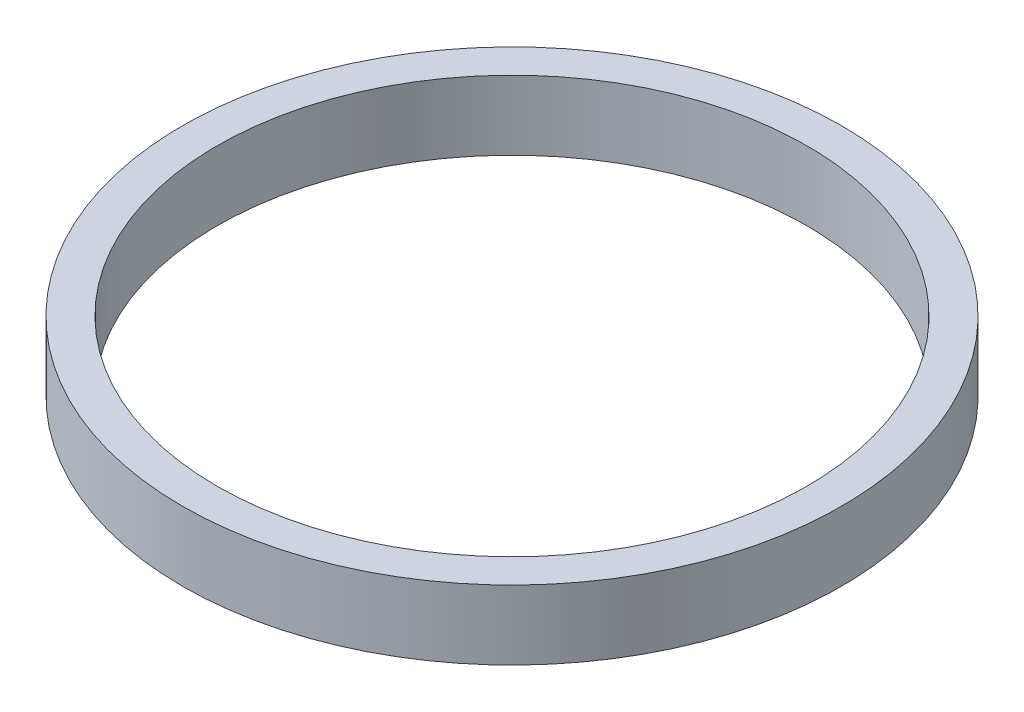
ISO-10303-21;
HEADER;
FILE_DESCRIPTION(('STEP AP214'),'2;1');
FILE_NAME('part.step','',(''),(''),'','','');
FILE_SCHEMA(('AUTOMOTIVE_DESIGN { 1 0 10303 214 1 1 1 1 }'));
ENDSEC;
DATA;
#1=APPLICATION_CONTEXT('core data for automotive mechanical design processes');
#2=APPLICATION_PROTOCOL_DEFINITION('international standard','automotive_design',2000,#1);
#3=PRODUCT_CONTEXT('',#1,'mechanical');
#4=PRODUCT('Part','Part','',(#3));
#5=PRODUCT_RELATED_PRODUCT_CATEGORY('part','',(#4));
#6=PRODUCT_DEFINITION_FORMATION('','',#4);
#7=PRODUCT_DEFINITION_CONTEXT('part definition',#1,'design');
#8=PRODUCT_DEFINITION('design','',#6,#7);
#9=PRODUCT_DEFINITION_SHAPE('','',#8);
#10=(LENGTH_UNIT() NAMED_UNIT(*) SI_UNIT(.MILLI.,.METRE.));
#11=(NAMED_UNIT(*) PLANE_ANGLE_UNIT() SI_UNIT($,.RADIAN.));
#12=(NAMED_UNIT(*) SI_UNIT($,.STERADIAN.) SOLID_ANGLE_UNIT());
#13=UNCERTAINTY_MEASURE_WITH_UNIT(LENGTH_MEASURE(1.E-05),#10,'distance_accuracy_value','');
#14=(GEOMETRIC_REPRESENTATION_CONTEXT(3) GLOBAL_UNCERTAINTY_ASSIGNED_CONTEXT((#13)) GLOBAL_UNIT_ASSIGNED_CONTEXT((#10,
#11,#12)) REPRESENTATION_CONTEXT('',''));
#15=CARTESIAN_POINT('',(0.,0.,0.));
#16=DIRECTION('',(0.,0.,1.));
#17=DIRECTION('',(1.,0.,0.));
#18=AXIS2_PLACEMENT_3D('',#15,#16,#17);
#19=CARTESIAN_POINT('',(0.,10.,0.));
#20=DIRECTION('',(0.,1.,0.));
#21=DIRECTION('',(0.,0.,1.));
#22=AXIS2_PLACEMENT_3D('',#19,#20,#21);
#23=PLANE('',#22);
#24=CARTESIAN_POINT('',(0.,10.,0.));
#25=DIRECTION('',(0.,1.,0.));
#26=DIRECTION('',(0.,0.,1.));
#27=AXIS2_PLACEMENT_3D('',#24,#25,#26);
#28=CIRCLE('',#27,47.55);
#29=CARTESIAN_POINT('',(0.,10.,47.55));
#30=VERTEX_POINT('',#29);
#31=EDGE_CURVE('E10',#30,#30,#28,.T.);
#32=ORIENTED_EDGE('',*,*,#31,.T.);
#33=EDGE_LOOP('',(#32));
#34=FACE_BOUND('',#33,.T.);
#35=CARTESIAN_POINT('',(0.,10.,0.));
#36=DIRECTION('',(0.,1.,0.));
#37=DIRECTION('',(0.,0.,1.));
#38=AXIS2_PLACEMENT_3D('',#35,#36,#37);
#39=CIRCLE('',#38,42.55);
#40=CARTESIAN_POINT('',(0.,10.,42.55));
#41=VERTEX_POINT('',#40);
#42=EDGE_CURVE('E54',#41,#41,#39,.T.);
#43=ORIENTED_EDGE('',*,*,#42,.F.);
#44=EDGE_LOOP('',(#43));
#45=FACE_BOUND('',#44,.T.);
#46=ADVANCED_FACE('F41',(#34,#45),#23,.T.);
#47=CARTESIAN_POINT('',(0.,0.,0.));
#48=DIRECTION('',(0.,1.,0.));
#49=DIRECTION('',(0.,0.,1.));
#50=AXIS2_PLACEMENT_3D('',#47,#48,#49);
#51=PLANE('',#50);
#52=CARTESIAN_POINT('',(0.,0.,0.));
#53=DIRECTION('',(0.,1.,0.));
#54=DIRECTION('',(0.,0.,1.));
#55=AXIS2_PLACEMENT_3D('',#52,#53,#54);
#56=CIRCLE('',#55,47.55);
#57=CARTESIAN_POINT('',(0.,0.,47.55));
#58=VERTEX_POINT('',#57);
#59=EDGE_CURVE('E45',#58,#58,#56,.T.);
#60=ORIENTED_EDGE('',*,*,#59,.F.);
#61=EDGE_LOOP('',(#60));
#62=FACE_BOUND('',#61,.T.);
#63=CARTESIAN_POINT('',(0.,0.,0.));
#64=DIRECTION('',(0.,1.,0.));
#65=DIRECTION('',(0.,0.,1.));
#66=AXIS2_PLACEMENT_3D('',#63,#64,#65);
#67=CIRCLE('',#66,42.55);
#68=CARTESIAN_POINT('',(0.,0.,42.55));
#69=VERTEX_POINT('',#68);
#70=EDGE_CURVE('E56',#69,#69,#67,.T.);
#71=ORIENTED_EDGE('',*,*,#70,.T.);
#72=EDGE_LOOP('',(#71));
#73=FACE_BOUND('',#72,.T.);
#74=ADVANCED_FACE('F68',(#62,#73),#51,.F.);
#75=CARTESIAN_POINT('',(0.,10.,0.));
#76=DIRECTION('',(0.,-1.,0.));
#77=DIRECTION('',(0.,0.,-1.));
#78=AXIS2_PLACEMENT_3D('',#75,#76,#77);
#79=CYLINDRICAL_SURFACE('',#78,47.55);
#80=ORIENTED_EDGE('',*,*,#31,.F.);
#81=EDGE_LOOP('',(#80));
#82=FACE_BOUND('',#81,.T.);
#83=ORIENTED_EDGE('',*,*,#59,.T.);
#84=EDGE_LOOP('',(#83));
#85=FACE_BOUND('',#84,.T.);
#86=ADVANCED_FACE('F43',(#82,#85),#79,.T.);
#87=CARTESIAN_POINT('',(0.,10.,0.));
#88=DIRECTION('',(0.,-1.,0.));
#89=DIRECTION('',(0.,0.,-1.));
#90=AXIS2_PLACEMENT_3D('',#87,#88,#89);
#91=CYLINDRICAL_SURFACE('',#90,42.55);
#92=ORIENTED_EDGE('',*,*,#42,.T.);
#93=EDGE_LOOP('',(#92));
#94=FACE_BOUND('',#93,.T.);
#95=ORIENTED_EDGE('',*,*,#70,.F.);
#96=EDGE_LOOP('',(#95));
#97=FACE_BOUND('',#96,.T.);
#98=ADVANCED_FACE('F64',(#94,#97),#91,.F.);
#99=CLOSED_SHELL('',(#46,#74,#86,#98));
#100=MANIFOLD_SOLID_BREP('B2',#99);
#101=ADVANCED_BREP_SHAPE_REPRESENTATION('',(#18,#100),#14);
#102=SHAPE_DEFINITION_REPRESENTATION(#9,#101);
ENDSEC;
END-ISO-10303-21;
